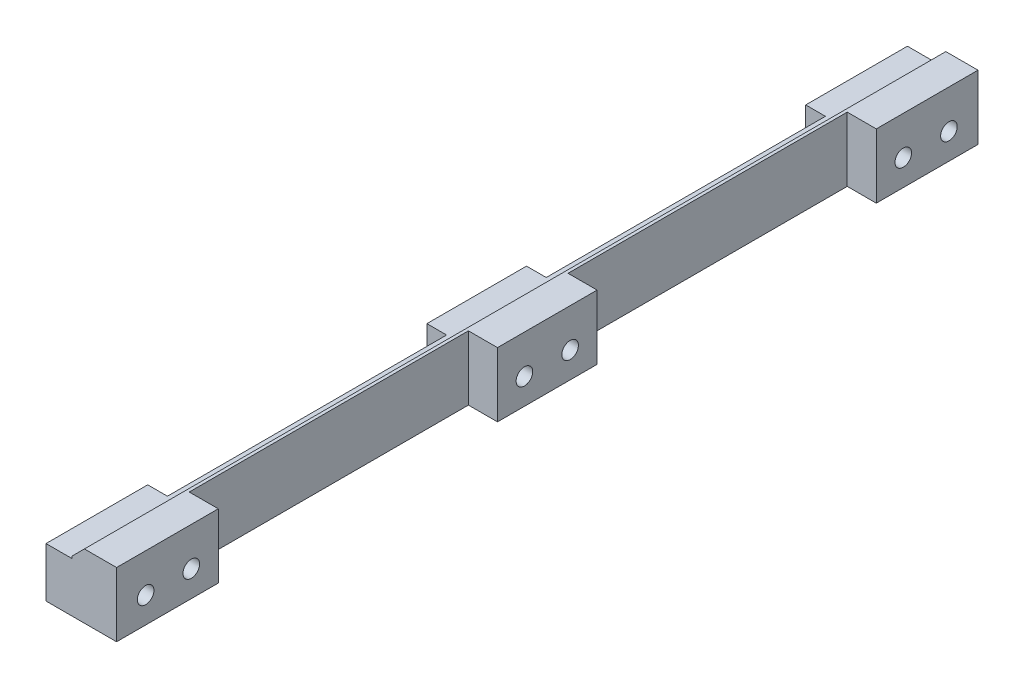
ISO-10303-21;
HEADER;
FILE_DESCRIPTION(('STEP AP214'),'2;1');
FILE_NAME('part.step','',(''),(''),'','','');
FILE_SCHEMA(('AUTOMOTIVE_DESIGN { 1 0 10303 214 1 1 1 1 }'));
ENDSEC;
DATA;
#1=APPLICATION_CONTEXT('core data for automotive mechanical design processes');
#2=APPLICATION_PROTOCOL_DEFINITION('international standard','automotive_design',2000,#1);
#3=PRODUCT_CONTEXT('',#1,'mechanical');
#4=PRODUCT('Part','Part','',(#3));
#5=PRODUCT_RELATED_PRODUCT_CATEGORY('part','',(#4));
#6=PRODUCT_DEFINITION_FORMATION('','',#4);
#7=PRODUCT_DEFINITION_CONTEXT('part definition',#1,'design');
#8=PRODUCT_DEFINITION('design','',#6,#7);
#9=PRODUCT_DEFINITION_SHAPE('','',#8);
#10=(LENGTH_UNIT() NAMED_UNIT(*) SI_UNIT(.MILLI.,.METRE.));
#11=(NAMED_UNIT(*) PLANE_ANGLE_UNIT() SI_UNIT($,.RADIAN.));
#12=(NAMED_UNIT(*) SI_UNIT($,.STERADIAN.) SOLID_ANGLE_UNIT());
#13=UNCERTAINTY_MEASURE_WITH_UNIT(LENGTH_MEASURE(1.E-05),#10,'distance_accuracy_value','');
#14=(GEOMETRIC_REPRESENTATION_CONTEXT(3) GLOBAL_UNCERTAINTY_ASSIGNED_CONTEXT((#13)) GLOBAL_UNIT_ASSIGNED_CONTEXT((#10,
#11,#12)) REPRESENTATION_CONTEXT('',''));
#15=CARTESIAN_POINT('',(0.,0.,0.));
#16=DIRECTION('',(0.,0.,1.));
#17=DIRECTION('',(1.,0.,0.));
#18=AXIS2_PLACEMENT_3D('',#15,#16,#17);
#19=CARTESIAN_POINT('',(0.,0.,46.3));
#20=DIRECTION('',(0.,0.,1.));
#21=DIRECTION('',(1.,0.,0.));
#22=AXIS2_PLACEMENT_3D('',#19,#20,#21);
#23=PLANE('',#22);
#24=DIRECTION('',(-1.,0.,0.));
#25=VECTOR('',#24,1.);
#26=CARTESIAN_POINT('',(1.9,1.6,46.3));
#27=LINE('',#26,#25);
#28=CARTESIAN_POINT('',(1.9,1.6,46.3));
#29=VERTEX_POINT('',#28);
#30=CARTESIAN_POINT('',(0.,1.6,46.3));
#31=VERTEX_POINT('',#30);
#32=EDGE_CURVE('E55',#29,#31,#27,.T.);
#33=ORIENTED_EDGE('',*,*,#32,.F.);
#34=DIRECTION('',(0.,-1.,0.));
#35=VECTOR('',#34,1.);
#36=CARTESIAN_POINT('',(1.9,4.8,46.3));
#37=LINE('',#36,#35);
#38=CARTESIAN_POINT('',(1.9,4.8,46.3));
#39=VERTEX_POINT('',#38);
#40=EDGE_CURVE('E59',#39,#29,#37,.T.);
#41=ORIENTED_EDGE('',*,*,#40,.F.);
#42=DIRECTION('',(-1.,0.,0.));
#43=VECTOR('',#42,1.);
#44=CARTESIAN_POINT('',(2.5,4.8,46.3));
#45=LINE('',#44,#43);
#46=CARTESIAN_POINT('',(0.,4.8,46.3));
#47=VERTEX_POINT('',#46);
#48=EDGE_CURVE('E317',#39,#47,#45,.T.);
#49=ORIENTED_EDGE('',*,*,#48,.T.);
#50=DIRECTION('',(0.,-1.,0.));
#51=VECTOR('',#50,1.);
#52=CARTESIAN_POINT('',(0.,4.8,46.3));
#53=LINE('',#52,#51);
#54=EDGE_CURVE('E304',#47,#31,#53,.T.);
#55=ORIENTED_EDGE('',*,*,#54,.T.);
#56=EDGE_LOOP('',(#33,#41,#49,#55));
#57=FACE_BOUND('',#56,.T.);
#58=ADVANCED_FACE('F39',(#57),#23,.T.);
#59=CARTESIAN_POINT('',(0.,0.,9.8));
#60=DIRECTION('',(0.,0.,1.));
#61=DIRECTION('',(1.,0.,0.));
#62=AXIS2_PLACEMENT_3D('',#59,#60,#61);
#63=PLANE('',#62);
#64=DIRECTION('',(-1.,0.,0.));
#65=VECTOR('',#64,1.);
#66=CARTESIAN_POINT('',(0.,1.6,9.8));
#67=LINE('',#66,#65);
#68=CARTESIAN_POINT('',(1.9,1.6,9.8));
#69=VERTEX_POINT('',#68);
#70=CARTESIAN_POINT('',(0.,1.6,9.8));
#71=VERTEX_POINT('',#70);
#72=EDGE_CURVE('E353',#69,#71,#67,.T.);
#73=ORIENTED_EDGE('',*,*,#72,.F.);
#74=DIRECTION('',(0.,-1.,0.));
#75=VECTOR('',#74,1.);
#76=CARTESIAN_POINT('',(1.9,4.8,9.8));
#77=LINE('',#76,#75);
#78=CARTESIAN_POINT('',(1.9,4.8,9.8));
#79=VERTEX_POINT('',#78);
#80=EDGE_CURVE('E365',#79,#69,#77,.T.);
#81=ORIENTED_EDGE('',*,*,#80,.F.);
#82=DIRECTION('',(-1.,0.,0.));
#83=VECTOR('',#82,1.);
#84=CARTESIAN_POINT('',(2.5,4.8,9.8));
#85=LINE('',#84,#83);
#86=CARTESIAN_POINT('',(0.,4.8,9.8));
#87=VERTEX_POINT('',#86);
#88=EDGE_CURVE('E404',#79,#87,#85,.T.);
#89=ORIENTED_EDGE('',*,*,#88,.T.);
#90=DIRECTION('',(0.,-1.,0.));
#91=VECTOR('',#90,1.);
#92=CARTESIAN_POINT('',(0.,4.8,9.8));
#93=LINE('',#92,#91);
#94=EDGE_CURVE('E391',#87,#71,#93,.T.);
#95=ORIENTED_EDGE('',*,*,#94,.T.);
#96=EDGE_LOOP('',(#73,#81,#89,#95));
#97=FACE_BOUND('',#96,.T.);
#98=ADVANCED_FACE('F493',(#97),#63,.T.);
#99=CARTESIAN_POINT('',(0.,4.8,9.8));
#100=DIRECTION('',(1.,0.,0.));
#101=DIRECTION('',(0.,1.,0.));
#102=AXIS2_PLACEMENT_3D('',#99,#100,#101);
#103=PLANE('',#102);
#104=CARTESIAN_POINT('',(0.,2.5,7.2));
#105=DIRECTION('',(-1.,0.,0.));
#106=DIRECTION('',(0.,0.,1.));
#107=AXIS2_PLACEMENT_3D('',#104,#105,#106);
#108=CIRCLE('',#107,0.8);
#109=CARTESIAN_POINT('',(0.,2.5,8.));
#110=VERTEX_POINT('',#109);
#111=EDGE_CURVE('E687',#110,#110,#108,.T.);
#112=ORIENTED_EDGE('',*,*,#111,.F.);
#113=EDGE_LOOP('',(#112));
#114=FACE_BOUND('',#113,.T.);
#115=CARTESIAN_POINT('',(0.,2.5,2.8));
#116=DIRECTION('',(-1.,0.,0.));
#117=DIRECTION('',(0.,0.,1.));
#118=AXIS2_PLACEMENT_3D('',#115,#116,#117);
#119=CIRCLE('',#118,0.8);
#120=CARTESIAN_POINT('',(0.,2.5,3.6));
#121=VERTEX_POINT('',#120);
#122=EDGE_CURVE('E691',#121,#121,#119,.T.);
#123=ORIENTED_EDGE('',*,*,#122,.F.);
#124=EDGE_LOOP('',(#123));
#125=FACE_BOUND('',#124,.T.);
#126=CARTESIAN_POINT('',(0.,2.5,39.3));
#127=DIRECTION('',(-1.,0.,0.));
#128=DIRECTION('',(0.,0.,1.));
#129=AXIS2_PLACEMENT_3D('',#126,#127,#128);
#130=CIRCLE('',#129,0.8);
#131=CARTESIAN_POINT('',(0.,2.5,40.1));
#132=VERTEX_POINT('',#131);
#133=EDGE_CURVE('E701',#132,#132,#130,.T.);
#134=ORIENTED_EDGE('',*,*,#133,.F.);
#135=EDGE_LOOP('',(#134));
#136=FACE_BOUND('',#135,.T.);
#137=CARTESIAN_POINT('',(0.,2.5,43.7));
#138=DIRECTION('',(-1.,0.,0.));
#139=DIRECTION('',(0.,0.,1.));
#140=AXIS2_PLACEMENT_3D('',#137,#138,#139);
#141=CIRCLE('',#140,0.8);
#142=CARTESIAN_POINT('',(0.,2.5,44.5));
#143=VERTEX_POINT('',#142);
#144=EDGE_CURVE('E709',#143,#143,#141,.T.);
#145=ORIENTED_EDGE('',*,*,#144,.F.);
#146=EDGE_LOOP('',(#145));
#147=FACE_BOUND('',#146,.T.);
#148=CARTESIAN_POINT('',(0.,2.5,75.8));
#149=DIRECTION('',(-1.,0.,0.));
#150=DIRECTION('',(0.,0.,1.));
#151=AXIS2_PLACEMENT_3D('',#148,#149,#150);
#152=CIRCLE('',#151,0.8);
#153=CARTESIAN_POINT('',(0.,2.5,76.6));
#154=VERTEX_POINT('',#153);
#155=EDGE_CURVE('E717',#154,#154,#152,.T.);
#156=ORIENTED_EDGE('',*,*,#155,.F.);
#157=EDGE_LOOP('',(#156));
#158=FACE_BOUND('',#157,.T.);
#159=CARTESIAN_POINT('',(0.,2.5,80.2));
#160=DIRECTION('',(-1.,0.,0.));
#161=DIRECTION('',(0.,0.,1.));
#162=AXIS2_PLACEMENT_3D('',#159,#160,#161);
#163=CIRCLE('',#162,0.8);
#164=CARTESIAN_POINT('',(0.,2.5,81.));
#165=VERTEX_POINT('',#164);
#166=EDGE_CURVE('E723',#165,#165,#163,.T.);
#167=ORIENTED_EDGE('',*,*,#166,.F.);
#168=EDGE_LOOP('',(#167));
#169=FACE_BOUND('',#168,.T.);
#170=DIRECTION('',(0.,-1.,0.));
#171=VECTOR('',#170,1.);
#172=CARTESIAN_POINT('',(0.,4.8,0.));
#173=LINE('',#172,#171);
#174=CARTESIAN_POINT('',(0.,4.8,0.));
#175=VERTEX_POINT('',#174);
#176=CARTESIAN_POINT('',(0.,0.,0.));
#177=VERTEX_POINT('',#176);
#178=EDGE_CURVE('E199',#175,#177,#173,.T.);
#179=ORIENTED_EDGE('',*,*,#178,.T.);
#180=DIRECTION('',(0.,0.,-1.));
#181=VECTOR('',#180,1.);
#182=CARTESIAN_POINT('',(0.,0.,9.8));
#183=LINE('',#182,#181);
#184=CARTESIAN_POINT('',(0.,0.,83.));
#185=VERTEX_POINT('',#184);
#186=EDGE_CURVE('E11',#185,#177,#183,.T.);
#187=ORIENTED_EDGE('',*,*,#186,.F.);
#188=DIRECTION('',(0.,-1.,0.));
#189=VECTOR('',#188,1.);
#190=CARTESIAN_POINT('',(0.,4.8,83.));
#191=LINE('',#190,#189);
#192=CARTESIAN_POINT('',(0.,4.8,83.));
#193=VERTEX_POINT('',#192);
#194=EDGE_CURVE('E196',#193,#185,#191,.T.);
#195=ORIENTED_EDGE('',*,*,#194,.F.);
#196=DIRECTION('',(0.,0.,-1.));
#197=VECTOR('',#196,1.);
#198=CARTESIAN_POINT('',(0.,4.8,83.));
#199=LINE('',#198,#197);
#200=CARTESIAN_POINT('',(0.,4.8,73.2));
#201=VERTEX_POINT('',#200);
#202=EDGE_CURVE('E241',#193,#201,#199,.T.);
#203=ORIENTED_EDGE('',*,*,#202,.T.);
#204=DIRECTION('',(0.,-1.,0.));
#205=VECTOR('',#204,1.);
#206=CARTESIAN_POINT('',(0.,4.8,73.2));
#207=LINE('',#206,#205);
#208=CARTESIAN_POINT('',(0.,1.6,73.2));
#209=VERTEX_POINT('',#208);
#210=EDGE_CURVE('E242',#201,#209,#207,.T.);
#211=ORIENTED_EDGE('',*,*,#210,.T.);
#212=DIRECTION('',(0.,0.,-1.));
#213=VECTOR('',#212,1.);
#214=CARTESIAN_POINT('',(0.,1.6,73.2));
#215=LINE('',#214,#213);
#216=EDGE_CURVE('E276',#209,#31,#215,.T.);
#217=ORIENTED_EDGE('',*,*,#216,.T.);
#218=ORIENTED_EDGE('',*,*,#54,.F.);
#219=DIRECTION('',(0.,0.,-1.));
#220=VECTOR('',#219,1.);
#221=CARTESIAN_POINT('',(0.,4.8,46.3));
#222=LINE('',#221,#220);
#223=CARTESIAN_POINT('',(0.,4.8,36.7));
#224=VERTEX_POINT('',#223);
#225=EDGE_CURVE('E320',#47,#224,#222,.T.);
#226=ORIENTED_EDGE('',*,*,#225,.T.);
#227=DIRECTION('',(0.,-1.,0.));
#228=VECTOR('',#227,1.);
#229=CARTESIAN_POINT('',(0.,4.8,36.7));
#230=LINE('',#229,#228);
#231=CARTESIAN_POINT('',(0.,1.6,36.7));
#232=VERTEX_POINT('',#231);
#233=EDGE_CURVE('E303',#224,#232,#230,.T.);
#234=ORIENTED_EDGE('',*,*,#233,.T.);
#235=DIRECTION('',(0.,0.,-1.));
#236=VECTOR('',#235,1.);
#237=CARTESIAN_POINT('',(0.,1.6,36.7));
#238=LINE('',#237,#236);
#239=EDGE_CURVE('E361',#232,#71,#238,.T.);
#240=ORIENTED_EDGE('',*,*,#239,.T.);
#241=ORIENTED_EDGE('',*,*,#94,.F.);
#242=DIRECTION('',(0.,0.,-1.));
#243=VECTOR('',#242,1.);
#244=CARTESIAN_POINT('',(0.,4.8,9.8));
#245=LINE('',#244,#243);
#246=EDGE_CURVE('E407',#87,#175,#245,.T.);
#247=ORIENTED_EDGE('',*,*,#246,.T.);
#248=EDGE_LOOP('',(#179,#187,#195,#203,#211,#217,#218,#226,#234,#240,#241,#247));
#249=FACE_BOUND('',#248,.T.);
#250=ADVANCED_FACE('F41',(#114,#125,#136,#147,#158,#169,#249),#103,.F.);
#251=CARTESIAN_POINT('',(0.,0.,9.8));
#252=DIRECTION('',(0.,1.,0.));
#253=DIRECTION('',(0.,0.,1.));
#254=AXIS2_PLACEMENT_3D('',#251,#252,#253);
#255=PLANE('',#254);
#256=DIRECTION('',(1.,0.,0.));
#257=VECTOR('',#256,1.);
#258=CARTESIAN_POINT('',(0.,0.,0.));
#259=LINE('',#258,#257);
#260=CARTESIAN_POINT('',(6.8,0.,0.));
#261=VERTEX_POINT('',#260);
#262=EDGE_CURVE('E410',#177,#261,#259,.T.);
#263=ORIENTED_EDGE('',*,*,#262,.T.);
#264=DIRECTION('',(0.,0.,-1.));
#265=VECTOR('',#264,1.);
#266=CARTESIAN_POINT('',(6.8,0.,9.8));
#267=LINE('',#266,#265);
#268=CARTESIAN_POINT('',(6.8,0.,9.8));
#269=VERTEX_POINT('',#268);
#270=EDGE_CURVE('E48',#269,#261,#267,.T.);
#271=ORIENTED_EDGE('',*,*,#270,.F.);
#272=DIRECTION('',(1.,0.,0.));
#273=VECTOR('',#272,1.);
#274=CARTESIAN_POINT('',(0.,0.,9.8));
#275=LINE('',#274,#273);
#276=CARTESIAN_POINT('',(4.,0.,9.8));
#277=VERTEX_POINT('',#276);
#278=EDGE_CURVE('E394',#277,#269,#275,.T.);
#279=ORIENTED_EDGE('',*,*,#278,.F.);
#280=DIRECTION('',(0.,0.,-1.));
#281=VECTOR('',#280,1.);
#282=CARTESIAN_POINT('',(4.,0.,36.7));
#283=LINE('',#282,#281);
#284=CARTESIAN_POINT('',(4.,0.,36.7));
#285=VERTEX_POINT('',#284);
#286=EDGE_CURVE('E387',#285,#277,#283,.T.);
#287=ORIENTED_EDGE('',*,*,#286,.F.);
#288=DIRECTION('',(1.,0.,0.));
#289=VECTOR('',#288,1.);
#290=CARTESIAN_POINT('',(0.,0.,36.7));
#291=LINE('',#290,#289);
#292=CARTESIAN_POINT('',(6.8,0.,36.7));
#293=VERTEX_POINT('',#292);
#294=EDGE_CURVE('E324',#285,#293,#291,.T.);
#295=ORIENTED_EDGE('',*,*,#294,.T.);
#296=DIRECTION('',(0.,0.,-1.));
#297=VECTOR('',#296,1.);
#298=CARTESIAN_POINT('',(6.8,0.,46.3));
#299=LINE('',#298,#297);
#300=CARTESIAN_POINT('',(6.8,0.,46.3));
#301=VERTEX_POINT('',#300);
#302=EDGE_CURVE('E343',#301,#293,#299,.T.);
#303=ORIENTED_EDGE('',*,*,#302,.F.);
#304=DIRECTION('',(1.,0.,0.));
#305=VECTOR('',#304,1.);
#306=CARTESIAN_POINT('',(0.,0.,46.3));
#307=LINE('',#306,#305);
#308=CARTESIAN_POINT('',(4.,0.,46.3));
#309=VERTEX_POINT('',#308);
#310=EDGE_CURVE('E307',#309,#301,#307,.T.);
#311=ORIENTED_EDGE('',*,*,#310,.F.);
#312=DIRECTION('',(0.,0.,-1.));
#313=VECTOR('',#312,1.);
#314=CARTESIAN_POINT('',(4.,0.,73.2));
#315=LINE('',#314,#313);
#316=CARTESIAN_POINT('',(4.,0.,73.2));
#317=VERTEX_POINT('',#316);
#318=EDGE_CURVE('E299',#317,#309,#315,.T.);
#319=ORIENTED_EDGE('',*,*,#318,.F.);
#320=DIRECTION('',(1.,0.,0.));
#321=VECTOR('',#320,1.);
#322=CARTESIAN_POINT('',(0.,0.,73.2));
#323=LINE('',#322,#321);
#324=CARTESIAN_POINT('',(6.8,0.,73.2));
#325=VERTEX_POINT('',#324);
#326=EDGE_CURVE('E246',#317,#325,#323,.T.);
#327=ORIENTED_EDGE('',*,*,#326,.T.);
#328=DIRECTION('',(0.,0.,-1.));
#329=VECTOR('',#328,1.);
#330=CARTESIAN_POINT('',(6.8,0.,83.));
#331=LINE('',#330,#329);
#332=CARTESIAN_POINT('',(6.8,0.,83.));
#333=VERTEX_POINT('',#332);
#334=EDGE_CURVE('E205',#333,#325,#331,.T.);
#335=ORIENTED_EDGE('',*,*,#334,.F.);
#336=DIRECTION('',(1.,0.,0.));
#337=VECTOR('',#336,1.);
#338=CARTESIAN_POINT('',(0.,0.,83.));
#339=LINE('',#338,#337);
#340=EDGE_CURVE('E202',#185,#333,#339,.T.);
#341=ORIENTED_EDGE('',*,*,#340,.F.);
#342=ORIENTED_EDGE('',*,*,#186,.T.);
#343=EDGE_LOOP('',(#263,#271,#279,#287,#295,#303,#311,#319,#327,#335,#341,#342));
#344=FACE_BOUND('',#343,.T.);
#345=ADVANCED_FACE('F203',(#344),#255,.F.);
#346=CARTESIAN_POINT('',(6.8,0.,9.8));
#347=DIRECTION('',(-1.,0.,0.));
#348=DIRECTION('',(0.,0.,1.));
#349=AXIS2_PLACEMENT_3D('',#346,#347,#348);
#350=PLANE('',#349);
#351=CARTESIAN_POINT('',(6.8,2.5,7.2));
#352=DIRECTION('',(-1.,0.,0.));
#353=DIRECTION('',(0.,0.,1.));
#354=AXIS2_PLACEMENT_3D('',#351,#352,#353);
#355=CIRCLE('',#354,0.799999999999999);
#356=CARTESIAN_POINT('',(6.8,2.5,8.));
#357=VERTEX_POINT('',#356);
#358=EDGE_CURVE('E684',#357,#357,#355,.T.);
#359=ORIENTED_EDGE('',*,*,#358,.T.);
#360=EDGE_LOOP('',(#359));
#361=FACE_BOUND('',#360,.T.);
#362=CARTESIAN_POINT('',(6.8,2.5,2.8));
#363=DIRECTION('',(-1.,0.,0.));
#364=DIRECTION('',(0.,0.,1.));
#365=AXIS2_PLACEMENT_3D('',#362,#363,#364);
#366=CIRCLE('',#365,0.799999999999999);
#367=CARTESIAN_POINT('',(6.8,2.5,3.6));
#368=VERTEX_POINT('',#367);
#369=EDGE_CURVE('E697',#368,#368,#366,.T.);
#370=ORIENTED_EDGE('',*,*,#369,.T.);
#371=EDGE_LOOP('',(#370));
#372=FACE_BOUND('',#371,.T.);
#373=DIRECTION('',(0.,1.,0.));
#374=VECTOR('',#373,1.);
#375=CARTESIAN_POINT('',(6.8,0.,0.));
#376=LINE('',#375,#374);
#377=CARTESIAN_POINT('',(6.8,6.2,0.));
#378=VERTEX_POINT('',#377);
#379=EDGE_CURVE('E413',#261,#378,#376,.T.);
#380=ORIENTED_EDGE('',*,*,#379,.T.);
#381=DIRECTION('',(0.,0.,-1.));
#382=VECTOR('',#381,1.);
#383=CARTESIAN_POINT('',(6.8,6.2,9.8));
#384=LINE('',#383,#382);
#385=CARTESIAN_POINT('',(6.8,6.2,9.8));
#386=VERTEX_POINT('',#385);
#387=EDGE_CURVE('E441',#386,#378,#384,.T.);
#388=ORIENTED_EDGE('',*,*,#387,.F.);
#389=DIRECTION('',(0.,1.,0.));
#390=VECTOR('',#389,1.);
#391=CARTESIAN_POINT('',(6.8,0.,9.8));
#392=LINE('',#391,#390);
#393=EDGE_CURVE('E398',#269,#386,#392,.T.);
#394=ORIENTED_EDGE('',*,*,#393,.F.);
#395=ORIENTED_EDGE('',*,*,#270,.T.);
#396=EDGE_LOOP('',(#380,#388,#394,#395));
#397=FACE_BOUND('',#396,.T.);
#398=ADVANCED_FACE('F450',(#361,#372,#397),#350,.F.);
#399=CARTESIAN_POINT('',(6.8,6.2,9.8));
#400=DIRECTION('',(0.,-1.,0.));
#401=DIRECTION('',(1.,0.,0.));
#402=AXIS2_PLACEMENT_3D('',#399,#400,#401);
#403=PLANE('',#402);
#404=DIRECTION('',(-1.,0.,0.));
#405=VECTOR('',#404,1.);
#406=CARTESIAN_POINT('',(6.8,6.2,0.));
#407=LINE('',#406,#405);
#408=CARTESIAN_POINT('',(3.7,6.2,0.));
#409=VERTEX_POINT('',#408);
#410=EDGE_CURVE('E416',#378,#409,#407,.T.);
#411=ORIENTED_EDGE('',*,*,#410,.T.);
#412=DIRECTION('',(0.,0.,-1.));
#413=VECTOR('',#412,1.);
#414=CARTESIAN_POINT('',(3.7,6.2,9.8));
#415=LINE('',#414,#413);
#416=CARTESIAN_POINT('',(3.7,6.2,83.));
#417=VERTEX_POINT('',#416);
#418=EDGE_CURVE('E437',#417,#409,#415,.T.);
#419=ORIENTED_EDGE('',*,*,#418,.F.);
#420=DIRECTION('',(-1.,0.,0.));
#421=VECTOR('',#420,1.);
#422=CARTESIAN_POINT('',(3.7,6.2,83.));
#423=LINE('',#422,#421);
#424=CARTESIAN_POINT('',(6.8,6.2,83.));
#425=VERTEX_POINT('',#424);
#426=EDGE_CURVE('E228',#425,#417,#423,.T.);
#427=ORIENTED_EDGE('',*,*,#426,.F.);
#428=DIRECTION('',(0.,0.,-1.));
#429=VECTOR('',#428,1.);
#430=CARTESIAN_POINT('',(6.8,6.2,83.));
#431=LINE('',#430,#429);
#432=CARTESIAN_POINT('',(6.8,6.2,73.2));
#433=VERTEX_POINT('',#432);
#434=EDGE_CURVE('E257',#425,#433,#431,.T.);
#435=ORIENTED_EDGE('',*,*,#434,.T.);
#436=DIRECTION('',(-1.,0.,0.));
#437=VECTOR('',#436,1.);
#438=CARTESIAN_POINT('',(3.7,6.2,73.2));
#439=LINE('',#438,#437);
#440=CARTESIAN_POINT('',(4.,6.2,73.2));
#441=VERTEX_POINT('',#440);
#442=EDGE_CURVE('E220',#433,#441,#439,.T.);
#443=ORIENTED_EDGE('',*,*,#442,.T.);
#444=DIRECTION('',(0.,0.,-1.));
#445=VECTOR('',#444,1.);
#446=CARTESIAN_POINT('',(4.,6.2,73.2));
#447=LINE('',#446,#445);
#448=CARTESIAN_POINT('',(4.,6.2,46.3));
#449=VERTEX_POINT('',#448);
#450=EDGE_CURVE('E295',#441,#449,#447,.T.);
#451=ORIENTED_EDGE('',*,*,#450,.T.);
#452=DIRECTION('',(-1.,0.,0.));
#453=VECTOR('',#452,1.);
#454=CARTESIAN_POINT('',(3.7,6.2,46.3));
#455=LINE('',#454,#453);
#456=CARTESIAN_POINT('',(6.8,6.2,46.3));
#457=VERTEX_POINT('',#456);
#458=EDGE_CURVE('E314',#457,#449,#455,.T.);
#459=ORIENTED_EDGE('',*,*,#458,.F.);
#460=DIRECTION('',(0.,0.,-1.));
#461=VECTOR('',#460,1.);
#462=CARTESIAN_POINT('',(6.8,6.2,46.3));
#463=LINE('',#462,#461);
#464=CARTESIAN_POINT('',(6.8,6.2,36.7));
#465=VERTEX_POINT('',#464);
#466=EDGE_CURVE('E339',#457,#465,#463,.T.);
#467=ORIENTED_EDGE('',*,*,#466,.T.);
#468=DIRECTION('',(-1.,0.,0.));
#469=VECTOR('',#468,1.);
#470=CARTESIAN_POINT('',(3.7,6.2,36.7));
#471=LINE('',#470,#469);
#472=CARTESIAN_POINT('',(4.,6.2,36.7));
#473=VERTEX_POINT('',#472);
#474=EDGE_CURVE('E330',#465,#473,#471,.T.);
#475=ORIENTED_EDGE('',*,*,#474,.T.);
#476=DIRECTION('',(0.,0.,-1.));
#477=VECTOR('',#476,1.);
#478=CARTESIAN_POINT('',(4.,6.2,36.7));
#479=LINE('',#478,#477);
#480=CARTESIAN_POINT('',(4.,6.2,9.8));
#481=VERTEX_POINT('',#480);
#482=EDGE_CURVE('E383',#473,#481,#479,.T.);
#483=ORIENTED_EDGE('',*,*,#482,.T.);
#484=DIRECTION('',(-1.,0.,0.));
#485=VECTOR('',#484,1.);
#486=CARTESIAN_POINT('',(6.8,6.2,9.8));
#487=LINE('',#486,#485);
#488=EDGE_CURVE('E401',#386,#481,#487,.T.);
#489=ORIENTED_EDGE('',*,*,#488,.F.);
#490=ORIENTED_EDGE('',*,*,#387,.T.);
#491=EDGE_LOOP('',(#411,#419,#427,#435,#443,#451,#459,#467,#475,#483,#489,#490));
#492=FACE_BOUND('',#491,.T.);
#493=ADVANCED_FACE('F459',(#492),#403,.F.);
#494=CARTESIAN_POINT('',(3.7,6.2,9.8));
#495=DIRECTION('',(0.707106781186549,-0.707106781186546,0.));
#496=DIRECTION('',(0.707106781186546,0.707106781186549,0.));
#497=AXIS2_PLACEMENT_3D('',#494,#495,#496);
#498=PLANE('',#497);
#499=DIRECTION('',(-0.707106781186546,-0.707106781186549,0.));
#500=VECTOR('',#499,1.);
#501=CARTESIAN_POINT('',(3.7,6.2,0.));
#502=LINE('',#501,#500);
#503=CARTESIAN_POINT('',(2.5,5.,0.));
#504=VERTEX_POINT('',#503);
#505=EDGE_CURVE('E419',#409,#504,#502,.T.);
#506=ORIENTED_EDGE('',*,*,#505,.T.);
#507=DIRECTION('',(0.,0.,-1.));
#508=VECTOR('',#507,1.);
#509=CARTESIAN_POINT('',(2.5,5.,9.8));
#510=LINE('',#509,#508);
#511=CARTESIAN_POINT('',(2.5,5.,83.));
#512=VERTEX_POINT('',#511);
#513=EDGE_CURVE('E433',#512,#504,#510,.T.);
#514=ORIENTED_EDGE('',*,*,#513,.F.);
#515=DIRECTION('',(-0.707106781186546,-0.707106781186549,0.));
#516=VECTOR('',#515,1.);
#517=CARTESIAN_POINT('',(2.5,5.,83.));
#518=LINE('',#517,#516);
#519=EDGE_CURVE('E232',#417,#512,#518,.T.);
#520=ORIENTED_EDGE('',*,*,#519,.F.);
#521=ORIENTED_EDGE('',*,*,#418,.T.);
#522=EDGE_LOOP('',(#506,#514,#520,#521));
#523=FACE_BOUND('',#522,.T.);
#524=ADVANCED_FACE('F464',(#523),#498,.F.);
#525=CARTESIAN_POINT('',(2.5,5.,9.8));
#526=DIRECTION('',(1.,0.,0.));
#527=DIRECTION('',(0.,0.,-1.));
#528=AXIS2_PLACEMENT_3D('',#525,#526,#527);
#529=PLANE('',#528);
#530=DIRECTION('',(0.,-1.,0.));
#531=VECTOR('',#530,1.);
#532=CARTESIAN_POINT('',(2.5,5.,0.));
#533=LINE('',#532,#531);
#534=CARTESIAN_POINT('',(2.5,4.8,0.));
#535=VERTEX_POINT('',#534);
#536=EDGE_CURVE('E422',#504,#535,#533,.T.);
#537=ORIENTED_EDGE('',*,*,#536,.T.);
#538=DIRECTION('',(0.,0.,-1.));
#539=VECTOR('',#538,1.);
#540=CARTESIAN_POINT('',(2.5,4.8,9.8));
#541=LINE('',#540,#539);
#542=CARTESIAN_POINT('',(2.5,4.8,83.));
#543=VERTEX_POINT('',#542);
#544=EDGE_CURVE('E429',#543,#535,#541,.T.);
#545=ORIENTED_EDGE('',*,*,#544,.F.);
#546=DIRECTION('',(0.,-1.,0.));
#547=VECTOR('',#546,1.);
#548=CARTESIAN_POINT('',(2.5,4.8,83.));
#549=LINE('',#548,#547);
#550=EDGE_CURVE('E236',#512,#543,#549,.T.);
#551=ORIENTED_EDGE('',*,*,#550,.F.);
#552=ORIENTED_EDGE('',*,*,#513,.T.);
#553=EDGE_LOOP('',(#537,#545,#551,#552));
#554=FACE_BOUND('',#553,.T.);
#555=ADVANCED_FACE('F467',(#554),#529,.F.);
#556=CARTESIAN_POINT('',(2.5,4.8,9.8));
#557=DIRECTION('',(0.,-1.,0.));
#558=DIRECTION('',(0.,0.,-1.));
#559=AXIS2_PLACEMENT_3D('',#556,#557,#558);
#560=PLANE('',#559);
#561=DIRECTION('',(-1.,0.,0.));
#562=VECTOR('',#561,1.);
#563=CARTESIAN_POINT('',(2.5,4.8,0.));
#564=LINE('',#563,#562);
#565=EDGE_CURVE('E395',#535,#175,#564,.T.);
#566=ORIENTED_EDGE('',*,*,#565,.T.);
#567=ORIENTED_EDGE('',*,*,#246,.F.);
#568=ORIENTED_EDGE('',*,*,#88,.F.);
#569=DIRECTION('',(0.,0.,-1.));
#570=VECTOR('',#569,1.);
#571=CARTESIAN_POINT('',(1.9,4.8,36.7));
#572=LINE('',#571,#570);
#573=CARTESIAN_POINT('',(1.9,4.8,36.7));
#574=VERTEX_POINT('',#573);
#575=EDGE_CURVE('E379',#574,#79,#572,.T.);
#576=ORIENTED_EDGE('',*,*,#575,.F.);
#577=DIRECTION('',(-1.,0.,0.));
#578=VECTOR('',#577,1.);
#579=CARTESIAN_POINT('',(2.5,4.8,36.7));
#580=LINE('',#579,#578);
#581=EDGE_CURVE('E308',#574,#224,#580,.T.);
#582=ORIENTED_EDGE('',*,*,#581,.T.);
#583=ORIENTED_EDGE('',*,*,#225,.F.);
#584=ORIENTED_EDGE('',*,*,#48,.F.);
#585=DIRECTION('',(0.,0.,-1.));
#586=VECTOR('',#585,1.);
#587=CARTESIAN_POINT('',(1.9,4.8,73.2));
#588=LINE('',#587,#586);
#589=CARTESIAN_POINT('',(1.9,4.8,73.2));
#590=VERTEX_POINT('',#589);
#591=EDGE_CURVE('E291',#590,#39,#588,.T.);
#592=ORIENTED_EDGE('',*,*,#591,.F.);
#593=DIRECTION('',(-1.,0.,0.));
#594=VECTOR('',#593,1.);
#595=CARTESIAN_POINT('',(2.5,4.8,73.2));
#596=LINE('',#595,#594);
#597=EDGE_CURVE('E217',#590,#201,#596,.T.);
#598=ORIENTED_EDGE('',*,*,#597,.T.);
#599=ORIENTED_EDGE('',*,*,#202,.F.);
#600=DIRECTION('',(-1.,0.,0.));
#601=VECTOR('',#600,1.);
#602=CARTESIAN_POINT('',(2.5,4.8,83.));
#603=LINE('',#602,#601);
#604=EDGE_CURVE('E214',#543,#193,#603,.T.);
#605=ORIENTED_EDGE('',*,*,#604,.F.);
#606=ORIENTED_EDGE('',*,*,#544,.T.);
#607=EDGE_LOOP('',(#566,#567,#568,#576,#582,#583,#584,#592,#598,#599,#605,#606));
#608=FACE_BOUND('',#607,.T.);
#609=ADVANCED_FACE('F470',(#608),#560,.F.);
#610=DIRECTION('',(0.,1.,0.));
#611=VECTOR('',#610,1.);
#612=CARTESIAN_POINT('',(4.,6.2,9.8));
#613=LINE('',#612,#611);
#614=EDGE_CURVE('E347',#277,#481,#613,.T.);
#615=ORIENTED_EDGE('',*,*,#614,.F.);
#616=ORIENTED_EDGE('',*,*,#278,.T.);
#617=ORIENTED_EDGE('',*,*,#393,.T.);
#618=ORIENTED_EDGE('',*,*,#488,.T.);
#619=EDGE_LOOP('',(#615,#616,#617,#618));
#620=FACE_BOUND('',#619,.T.);
#621=ADVANCED_FACE('F514',(#620),#63,.T.);
#622=CARTESIAN_POINT('',(0.,0.,0.));
#623=DIRECTION('',(0.,0.,1.));
#624=DIRECTION('',(1.,0.,0.));
#625=AXIS2_PLACEMENT_3D('',#622,#623,#624);
#626=PLANE('',#625);
#627=ORIENTED_EDGE('',*,*,#178,.F.);
#628=ORIENTED_EDGE('',*,*,#565,.F.);
#629=ORIENTED_EDGE('',*,*,#536,.F.);
#630=ORIENTED_EDGE('',*,*,#505,.F.);
#631=ORIENTED_EDGE('',*,*,#410,.F.);
#632=ORIENTED_EDGE('',*,*,#379,.F.);
#633=ORIENTED_EDGE('',*,*,#262,.F.);
#634=EDGE_LOOP('',(#627,#628,#629,#630,#631,#632,#633));
#635=FACE_BOUND('',#634,.T.);
#636=ADVANCED_FACE('F455',(#635),#626,.F.);
#637=CARTESIAN_POINT('',(4.,6.2,36.7));
#638=DIRECTION('',(-1.,0.,0.));
#639=DIRECTION('',(0.,-1.,0.));
#640=AXIS2_PLACEMENT_3D('',#637,#638,#639);
#641=PLANE('',#640);
#642=ORIENTED_EDGE('',*,*,#614,.T.);
#643=ORIENTED_EDGE('',*,*,#482,.F.);
#644=DIRECTION('',(0.,1.,0.));
#645=VECTOR('',#644,1.);
#646=CARTESIAN_POINT('',(4.,6.2,36.7));
#647=LINE('',#646,#645);
#648=EDGE_CURVE('E348',#285,#473,#647,.T.);
#649=ORIENTED_EDGE('',*,*,#648,.F.);
#650=ORIENTED_EDGE('',*,*,#286,.T.);
#651=EDGE_LOOP('',(#642,#643,#649,#650));
#652=FACE_BOUND('',#651,.T.);
#653=ADVANCED_FACE('F497',(#652),#641,.F.);
#654=CARTESIAN_POINT('',(1.9,4.8,36.7));
#655=DIRECTION('',(1.,0.,0.));
#656=DIRECTION('',(0.,1.,0.));
#657=AXIS2_PLACEMENT_3D('',#654,#655,#656);
#658=PLANE('',#657);
#659=ORIENTED_EDGE('',*,*,#80,.T.);
#660=DIRECTION('',(0.,0.,-1.));
#661=VECTOR('',#660,1.);
#662=CARTESIAN_POINT('',(1.9,1.6,36.7));
#663=LINE('',#662,#661);
#664=CARTESIAN_POINT('',(1.9,1.6,36.7));
#665=VERTEX_POINT('',#664);
#666=EDGE_CURVE('E375',#665,#69,#663,.T.);
#667=ORIENTED_EDGE('',*,*,#666,.F.);
#668=DIRECTION('',(0.,-1.,0.));
#669=VECTOR('',#668,1.);
#670=CARTESIAN_POINT('',(1.9,4.8,36.7));
#671=LINE('',#670,#669);
#672=EDGE_CURVE('E352',#574,#665,#671,.T.);
#673=ORIENTED_EDGE('',*,*,#672,.F.);
#674=ORIENTED_EDGE('',*,*,#575,.T.);
#675=EDGE_LOOP('',(#659,#667,#673,#674));
#676=FACE_BOUND('',#675,.T.);
#677=ADVANCED_FACE('F495',(#676),#658,.F.);
#678=CARTESIAN_POINT('',(0.,1.6,36.7));
#679=DIRECTION('',(0.,-1.,0.));
#680=DIRECTION('',(0.,0.,-1.));
#681=AXIS2_PLACEMENT_3D('',#678,#679,#680);
#682=PLANE('',#681);
#683=ORIENTED_EDGE('',*,*,#72,.T.);
#684=ORIENTED_EDGE('',*,*,#239,.F.);
#685=DIRECTION('',(-1.,0.,0.));
#686=VECTOR('',#685,1.);
#687=CARTESIAN_POINT('',(0.,1.6,36.7));
#688=LINE('',#687,#686);
#689=EDGE_CURVE('E357',#665,#232,#688,.T.);
#690=ORIENTED_EDGE('',*,*,#689,.F.);
#691=ORIENTED_EDGE('',*,*,#666,.T.);
#692=EDGE_LOOP('',(#683,#684,#690,#691));
#693=FACE_BOUND('',#692,.T.);
#694=ADVANCED_FACE('F491',(#693),#682,.F.);
#695=CARTESIAN_POINT('',(0.,0.,36.7));
#696=DIRECTION('',(0.,0.,1.));
#697=DIRECTION('',(1.,0.,0.));
#698=AXIS2_PLACEMENT_3D('',#695,#696,#697);
#699=PLANE('',#698);
#700=ORIENTED_EDGE('',*,*,#294,.F.);
#701=ORIENTED_EDGE('',*,*,#648,.T.);
#702=ORIENTED_EDGE('',*,*,#474,.F.);
#703=DIRECTION('',(0.,1.,0.));
#704=VECTOR('',#703,1.);
#705=CARTESIAN_POINT('',(6.8,6.2,36.7));
#706=LINE('',#705,#704);
#707=EDGE_CURVE('E327',#293,#465,#706,.T.);
#708=ORIENTED_EDGE('',*,*,#707,.F.);
#709=EDGE_LOOP('',(#700,#701,#702,#708));
#710=FACE_BOUND('',#709,.T.);
#711=ADVANCED_FACE('F503',(#710),#699,.F.);
#712=ORIENTED_EDGE('',*,*,#581,.F.);
#713=ORIENTED_EDGE('',*,*,#672,.T.);
#714=ORIENTED_EDGE('',*,*,#689,.T.);
#715=ORIENTED_EDGE('',*,*,#233,.F.);
#716=EDGE_LOOP('',(#712,#713,#714,#715));
#717=FACE_BOUND('',#716,.T.);
#718=ADVANCED_FACE('F487',(#717),#699,.F.);
#719=CARTESIAN_POINT('',(6.8,6.2,46.3));
#720=DIRECTION('',(-1.,0.,0.));
#721=DIRECTION('',(0.,-1.,0.));
#722=AXIS2_PLACEMENT_3D('',#719,#720,#721);
#723=PLANE('',#722);
#724=CARTESIAN_POINT('',(6.8,2.5,39.3));
#725=DIRECTION('',(-1.,0.,0.));
#726=DIRECTION('',(0.,0.,1.));
#727=AXIS2_PLACEMENT_3D('',#724,#725,#726);
#728=CIRCLE('',#727,0.799999999999999);
#729=CARTESIAN_POINT('',(6.8,2.5,40.1));
#730=VERTEX_POINT('',#729);
#731=EDGE_CURVE('E705',#730,#730,#728,.T.);
#732=ORIENTED_EDGE('',*,*,#731,.T.);
#733=EDGE_LOOP('',(#732));
#734=FACE_BOUND('',#733,.T.);
#735=CARTESIAN_POINT('',(6.8,2.5,43.7));
#736=DIRECTION('',(-1.,0.,0.));
#737=DIRECTION('',(0.,0.,1.));
#738=AXIS2_PLACEMENT_3D('',#735,#736,#737);
#739=CIRCLE('',#738,0.799999999999999);
#740=CARTESIAN_POINT('',(6.8,2.5,44.5));
#741=VERTEX_POINT('',#740);
#742=EDGE_CURVE('E713',#741,#741,#739,.T.);
#743=ORIENTED_EDGE('',*,*,#742,.T.);
#744=EDGE_LOOP('',(#743));
#745=FACE_BOUND('',#744,.T.);
#746=ORIENTED_EDGE('',*,*,#707,.T.);
#747=ORIENTED_EDGE('',*,*,#466,.F.);
#748=DIRECTION('',(0.,1.,0.));
#749=VECTOR('',#748,1.);
#750=CARTESIAN_POINT('',(6.8,6.2,46.3));
#751=LINE('',#750,#749);
#752=EDGE_CURVE('E311',#301,#457,#751,.T.);
#753=ORIENTED_EDGE('',*,*,#752,.F.);
#754=ORIENTED_EDGE('',*,*,#302,.T.);
#755=EDGE_LOOP('',(#746,#747,#753,#754));
#756=FACE_BOUND('',#755,.T.);
#757=ADVANCED_FACE('F519',(#734,#745,#756),#723,.F.);
#758=DIRECTION('',(0.,1.,0.));
#759=VECTOR('',#758,1.);
#760=CARTESIAN_POINT('',(4.,6.2,46.3));
#761=LINE('',#760,#759);
#762=EDGE_CURVE('E263',#309,#449,#761,.T.);
#763=ORIENTED_EDGE('',*,*,#762,.F.);
#764=ORIENTED_EDGE('',*,*,#310,.T.);
#765=ORIENTED_EDGE('',*,*,#752,.T.);
#766=ORIENTED_EDGE('',*,*,#458,.T.);
#767=EDGE_LOOP('',(#763,#764,#765,#766));
#768=FACE_BOUND('',#767,.T.);
#769=ADVANCED_FACE('F509',(#768),#23,.T.);
#770=CARTESIAN_POINT('',(4.,6.2,73.2));
#771=DIRECTION('',(-1.,0.,0.));
#772=DIRECTION('',(0.,-1.,0.));
#773=AXIS2_PLACEMENT_3D('',#770,#771,#772);
#774=PLANE('',#773);
#775=ORIENTED_EDGE('',*,*,#762,.T.);
#776=ORIENTED_EDGE('',*,*,#450,.F.);
#777=DIRECTION('',(0.,1.,0.));
#778=VECTOR('',#777,1.);
#779=CARTESIAN_POINT('',(4.,6.2,73.2));
#780=LINE('',#779,#778);
#781=EDGE_CURVE('E264',#317,#441,#780,.T.);
#782=ORIENTED_EDGE('',*,*,#781,.F.);
#783=ORIENTED_EDGE('',*,*,#318,.T.);
#784=EDGE_LOOP('',(#775,#776,#782,#783));
#785=FACE_BOUND('',#784,.T.);
#786=ADVANCED_FACE('F518',(#785),#774,.F.);
#787=CARTESIAN_POINT('',(1.9,4.8,73.2));
#788=DIRECTION('',(1.,0.,0.));
#789=DIRECTION('',(0.,1.,0.));
#790=AXIS2_PLACEMENT_3D('',#787,#788,#789);
#791=PLANE('',#790);
#792=ORIENTED_EDGE('',*,*,#40,.T.);
#793=DIRECTION('',(0.,0.,-1.));
#794=VECTOR('',#793,1.);
#795=CARTESIAN_POINT('',(1.9,1.6,73.2));
#796=LINE('',#795,#794);
#797=CARTESIAN_POINT('',(1.9,1.6,73.2));
#798=VERTEX_POINT('',#797);
#799=EDGE_CURVE('E287',#798,#29,#796,.T.);
#800=ORIENTED_EDGE('',*,*,#799,.F.);
#801=DIRECTION('',(0.,-1.,0.));
#802=VECTOR('',#801,1.);
#803=CARTESIAN_POINT('',(1.9,4.8,73.2));
#804=LINE('',#803,#802);
#805=EDGE_CURVE('E268',#590,#798,#804,.T.);
#806=ORIENTED_EDGE('',*,*,#805,.F.);
#807=ORIENTED_EDGE('',*,*,#591,.T.);
#808=EDGE_LOOP('',(#792,#800,#806,#807));
#809=FACE_BOUND('',#808,.T.);
#810=ADVANCED_FACE('F525',(#809),#791,.F.);
#811=CARTESIAN_POINT('',(1.9,1.6,73.2));
#812=DIRECTION('',(0.,-1.,0.));
#813=DIRECTION('',(1.,0.,0.));
#814=AXIS2_PLACEMENT_3D('',#811,#812,#813);
#815=PLANE('',#814);
#816=ORIENTED_EDGE('',*,*,#32,.T.);
#817=ORIENTED_EDGE('',*,*,#216,.F.);
#818=DIRECTION('',(-1.,0.,0.));
#819=VECTOR('',#818,1.);
#820=CARTESIAN_POINT('',(1.9,1.6,73.2));
#821=LINE('',#820,#819);
#822=EDGE_CURVE('E272',#798,#209,#821,.T.);
#823=ORIENTED_EDGE('',*,*,#822,.F.);
#824=ORIENTED_EDGE('',*,*,#799,.T.);
#825=EDGE_LOOP('',(#816,#817,#823,#824));
#826=FACE_BOUND('',#825,.T.);
#827=ADVANCED_FACE('F479',(#826),#815,.F.);
#828=CARTESIAN_POINT('',(0.,0.,73.2));
#829=DIRECTION('',(0.,0.,1.));
#830=DIRECTION('',(1.,0.,0.));
#831=AXIS2_PLACEMENT_3D('',#828,#829,#830);
#832=PLANE('',#831);
#833=ORIENTED_EDGE('',*,*,#326,.F.);
#834=ORIENTED_EDGE('',*,*,#781,.T.);
#835=ORIENTED_EDGE('',*,*,#442,.F.);
#836=DIRECTION('',(0.,1.,0.));
#837=VECTOR('',#836,1.);
#838=CARTESIAN_POINT('',(6.8,6.2,73.2));
#839=LINE('',#838,#837);
#840=EDGE_CURVE('E249',#325,#433,#839,.T.);
#841=ORIENTED_EDGE('',*,*,#840,.F.);
#842=EDGE_LOOP('',(#833,#834,#835,#841));
#843=FACE_BOUND('',#842,.T.);
#844=ADVANCED_FACE('F537',(#843),#832,.F.);
#845=ORIENTED_EDGE('',*,*,#597,.F.);
#846=ORIENTED_EDGE('',*,*,#805,.T.);
#847=ORIENTED_EDGE('',*,*,#822,.T.);
#848=ORIENTED_EDGE('',*,*,#210,.F.);
#849=EDGE_LOOP('',(#845,#846,#847,#848));
#850=FACE_BOUND('',#849,.T.);
#851=ADVANCED_FACE('F475',(#850),#832,.F.);
#852=CARTESIAN_POINT('',(6.8,6.2,83.));
#853=DIRECTION('',(-1.,0.,0.));
#854=DIRECTION('',(0.,-1.,0.));
#855=AXIS2_PLACEMENT_3D('',#852,#853,#854);
#856=PLANE('',#855);
#857=CARTESIAN_POINT('',(6.8,2.5,75.8));
#858=DIRECTION('',(-1.,0.,0.));
#859=DIRECTION('',(0.,0.,1.));
#860=AXIS2_PLACEMENT_3D('',#857,#858,#859);
#861=CIRCLE('',#860,0.799999999999999);
#862=CARTESIAN_POINT('',(6.8,2.5,76.6));
#863=VERTEX_POINT('',#862);
#864=EDGE_CURVE('E721',#863,#863,#861,.T.);
#865=ORIENTED_EDGE('',*,*,#864,.T.);
#866=EDGE_LOOP('',(#865));
#867=FACE_BOUND('',#866,.T.);
#868=CARTESIAN_POINT('',(6.8,2.5,80.2));
#869=DIRECTION('',(-1.,0.,0.));
#870=DIRECTION('',(0.,0.,1.));
#871=AXIS2_PLACEMENT_3D('',#868,#869,#870);
#872=CIRCLE('',#871,0.799999999999999);
#873=CARTESIAN_POINT('',(6.8,2.5,81.));
#874=VERTEX_POINT('',#873);
#875=EDGE_CURVE('E223',#874,#874,#872,.T.);
#876=ORIENTED_EDGE('',*,*,#875,.T.);
#877=EDGE_LOOP('',(#876));
#878=FACE_BOUND('',#877,.T.);
#879=ORIENTED_EDGE('',*,*,#840,.T.);
#880=ORIENTED_EDGE('',*,*,#434,.F.);
#881=DIRECTION('',(0.,1.,0.));
#882=VECTOR('',#881,1.);
#883=CARTESIAN_POINT('',(6.8,6.2,83.));
#884=LINE('',#883,#882);
#885=EDGE_CURVE('E209',#333,#425,#884,.T.);
#886=ORIENTED_EDGE('',*,*,#885,.F.);
#887=ORIENTED_EDGE('',*,*,#334,.T.);
#888=EDGE_LOOP('',(#879,#880,#886,#887));
#889=FACE_BOUND('',#888,.T.);
#890=ADVANCED_FACE('F541',(#867,#878,#889),#856,.F.);
#891=CARTESIAN_POINT('',(0.,0.,83.));
#892=DIRECTION('',(0.,0.,1.));
#893=DIRECTION('',(1.,0.,0.));
#894=AXIS2_PLACEMENT_3D('',#891,#892,#893);
#895=PLANE('',#894);
#896=ORIENTED_EDGE('',*,*,#194,.T.);
#897=ORIENTED_EDGE('',*,*,#340,.T.);
#898=ORIENTED_EDGE('',*,*,#885,.T.);
#899=ORIENTED_EDGE('',*,*,#426,.T.);
#900=ORIENTED_EDGE('',*,*,#519,.T.);
#901=ORIENTED_EDGE('',*,*,#550,.T.);
#902=ORIENTED_EDGE('',*,*,#604,.T.);
#903=EDGE_LOOP('',(#896,#897,#898,#899,#900,#901,#902));
#904=FACE_BOUND('',#903,.T.);
#905=ADVANCED_FACE('F211',(#904),#895,.T.);
#906=CARTESIAN_POINT('',(0.,2.5,80.2));
#907=DIRECTION('',(-1.,0.,0.));
#908=DIRECTION('',(0.,0.,1.));
#909=AXIS2_PLACEMENT_3D('',#906,#907,#908);
#910=CYLINDRICAL_SURFACE('',#909,0.799999999999999);
#911=ORIENTED_EDGE('',*,*,#875,.F.);
#912=EDGE_LOOP('',(#911));
#913=FACE_BOUND('',#912,.T.);
#914=ORIENTED_EDGE('',*,*,#166,.T.);
#915=EDGE_LOOP('',(#914));
#916=FACE_BOUND('',#915,.T.);
#917=ADVANCED_FACE('F549',(#913,#916),#910,.F.);
#918=CARTESIAN_POINT('',(0.,2.5,75.8));
#919=DIRECTION('',(-1.,0.,0.));
#920=DIRECTION('',(0.,0.,1.));
#921=AXIS2_PLACEMENT_3D('',#918,#919,#920);
#922=CYLINDRICAL_SURFACE('',#921,0.799999999999999);
#923=ORIENTED_EDGE('',*,*,#864,.F.);
#924=EDGE_LOOP('',(#923));
#925=FACE_BOUND('',#924,.T.);
#926=ORIENTED_EDGE('',*,*,#155,.T.);
#927=EDGE_LOOP('',(#926));
#928=FACE_BOUND('',#927,.T.);
#929=ADVANCED_FACE('F627',(#925,#928),#922,.F.);
#930=CARTESIAN_POINT('',(0.,2.5,43.7));
#931=DIRECTION('',(-1.,0.,0.));
#932=DIRECTION('',(0.,0.,1.));
#933=AXIS2_PLACEMENT_3D('',#930,#931,#932);
#934=CYLINDRICAL_SURFACE('',#933,0.799999999999999);
#935=ORIENTED_EDGE('',*,*,#742,.F.);
#936=EDGE_LOOP('',(#935));
#937=FACE_BOUND('',#936,.T.);
#938=ORIENTED_EDGE('',*,*,#144,.T.);
#939=EDGE_LOOP('',(#938));
#940=FACE_BOUND('',#939,.T.);
#941=ADVANCED_FACE('F637',(#937,#940),#934,.F.);
#942=CARTESIAN_POINT('',(0.,2.5,39.3));
#943=DIRECTION('',(-1.,0.,0.));
#944=DIRECTION('',(0.,0.,1.));
#945=AXIS2_PLACEMENT_3D('',#942,#943,#944);
#946=CYLINDRICAL_SURFACE('',#945,0.799999999999999);
#947=ORIENTED_EDGE('',*,*,#731,.F.);
#948=EDGE_LOOP('',(#947));
#949=FACE_BOUND('',#948,.T.);
#950=ORIENTED_EDGE('',*,*,#133,.T.);
#951=EDGE_LOOP('',(#950));
#952=FACE_BOUND('',#951,.T.);
#953=ADVANCED_FACE('F647',(#949,#952),#946,.F.);
#954=CARTESIAN_POINT('',(0.,2.5,2.8));
#955=DIRECTION('',(-1.,0.,0.));
#956=DIRECTION('',(0.,0.,1.));
#957=AXIS2_PLACEMENT_3D('',#954,#955,#956);
#958=CYLINDRICAL_SURFACE('',#957,0.799999999999999);
#959=ORIENTED_EDGE('',*,*,#369,.F.);
#960=EDGE_LOOP('',(#959));
#961=FACE_BOUND('',#960,.T.);
#962=ORIENTED_EDGE('',*,*,#122,.T.);
#963=EDGE_LOOP('',(#962));
#964=FACE_BOUND('',#963,.T.);
#965=ADVANCED_FACE('F657',(#961,#964),#958,.F.);
#966=CARTESIAN_POINT('',(0.,2.5,7.2));
#967=DIRECTION('',(-1.,0.,0.));
#968=DIRECTION('',(0.,0.,1.));
#969=AXIS2_PLACEMENT_3D('',#966,#967,#968);
#970=CYLINDRICAL_SURFACE('',#969,0.799999999999999);
#971=ORIENTED_EDGE('',*,*,#358,.F.);
#972=EDGE_LOOP('',(#971));
#973=FACE_BOUND('',#972,.T.);
#974=ORIENTED_EDGE('',*,*,#111,.T.);
#975=EDGE_LOOP('',(#974));
#976=FACE_BOUND('',#975,.T.);
#977=ADVANCED_FACE('F667',(#973,#976),#970,.F.);
#978=CLOSED_SHELL('',(#58,#98,#250,#345,#398,#493,#524,#555,#609,#621,#636,#653,#677,#694,#711,
#718,#757,#769,#786,#810,#827,#844,#851,#890,#905,#917,#929,#941,#953,#965,#977));
#979=MANIFOLD_SOLID_BREP('B2',#978);
#980=ADVANCED_BREP_SHAPE_REPRESENTATION('',(#18,#979),#14);
#981=SHAPE_DEFINITION_REPRESENTATION(#9,#980);
ENDSEC;
END-ISO-10303-21;
